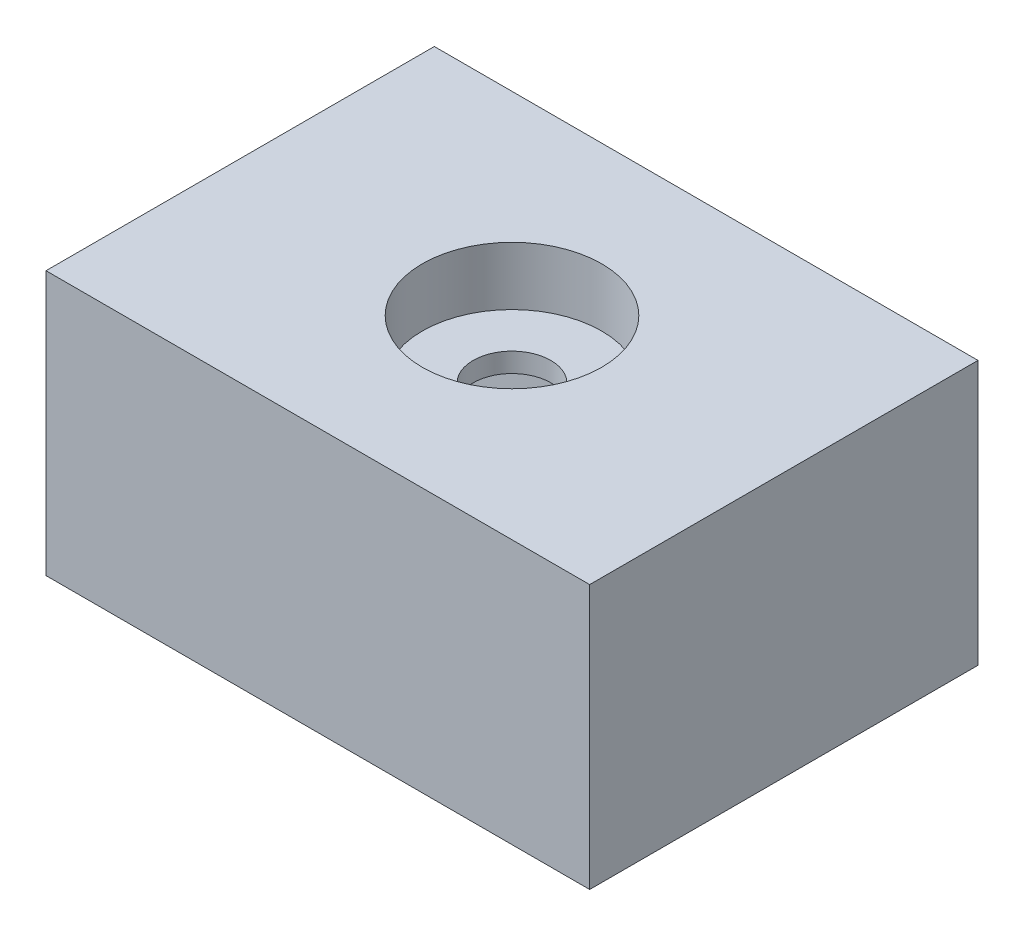
ISO-10303-21;
HEADER;
FILE_DESCRIPTION(('STEP AP214'),'2;1');
FILE_NAME('part.step','',(''),(''),'','','');
FILE_SCHEMA(('AUTOMOTIVE_DESIGN { 1 0 10303 214 1 1 1 1 }'));
ENDSEC;
DATA;
#1=APPLICATION_CONTEXT('core data for automotive mechanical design processes');
#2=APPLICATION_PROTOCOL_DEFINITION('international standard','automotive_design',2000,#1);
#3=PRODUCT_CONTEXT('',#1,'mechanical');
#4=PRODUCT('Part','Part','',(#3));
#5=PRODUCT_RELATED_PRODUCT_CATEGORY('part','',(#4));
#6=PRODUCT_DEFINITION_FORMATION('','',#4);
#7=PRODUCT_DEFINITION_CONTEXT('part definition',#1,'design');
#8=PRODUCT_DEFINITION('design','',#6,#7);
#9=PRODUCT_DEFINITION_SHAPE('','',#8);
#10=(LENGTH_UNIT() NAMED_UNIT(*) SI_UNIT(.MILLI.,.METRE.));
#11=(NAMED_UNIT(*) PLANE_ANGLE_UNIT() SI_UNIT($,.RADIAN.));
#12=(NAMED_UNIT(*) SI_UNIT($,.STERADIAN.) SOLID_ANGLE_UNIT());
#13=UNCERTAINTY_MEASURE_WITH_UNIT(LENGTH_MEASURE(1.E-05),#10,'distance_accuracy_value','');
#14=(GEOMETRIC_REPRESENTATION_CONTEXT(3) GLOBAL_UNCERTAINTY_ASSIGNED_CONTEXT((#13)) GLOBAL_UNIT_ASSIGNED_CONTEXT((#10,
#11,#12)) REPRESENTATION_CONTEXT('',''));
#15=CARTESIAN_POINT('',(0.,0.,0.));
#16=DIRECTION('',(0.,0.,1.));
#17=DIRECTION('',(1.,0.,0.));
#18=AXIS2_PLACEMENT_3D('',#15,#16,#17);
#19=CARTESIAN_POINT('',(88.9,86.36,-63.5));
#20=DIRECTION('',(-1.,0.,0.));
#21=DIRECTION('',(0.,0.,1.));
#22=AXIS2_PLACEMENT_3D('',#19,#20,#21);
#23=PLANE('',#22);
#24=DIRECTION('',(0.,0.,-1.));
#25=VECTOR('',#24,1.);
#26=CARTESIAN_POINT('',(88.9,0.,-63.5));
#27=LINE('',#26,#25);
#28=CARTESIAN_POINT('',(88.9,0.,63.5));
#29=VERTEX_POINT('',#28);
#30=CARTESIAN_POINT('',(88.9,0.,-63.5));
#31=VERTEX_POINT('',#30);
#32=EDGE_CURVE('E165',#29,#31,#27,.T.);
#33=ORIENTED_EDGE('',*,*,#32,.T.);
#34=DIRECTION('',(0.,-1.,0.));
#35=VECTOR('',#34,1.);
#36=CARTESIAN_POINT('',(88.9,86.36,-63.5));
#37=LINE('',#36,#35);
#38=CARTESIAN_POINT('',(88.9,86.36,-63.5));
#39=VERTEX_POINT('',#38);
#40=EDGE_CURVE('E11',#39,#31,#37,.T.);
#41=ORIENTED_EDGE('',*,*,#40,.F.);
#42=DIRECTION('',(0.,0.,-1.));
#43=VECTOR('',#42,1.);
#44=CARTESIAN_POINT('',(88.9,86.36,-63.5));
#45=LINE('',#44,#43);
#46=CARTESIAN_POINT('',(88.9,86.36,63.5));
#47=VERTEX_POINT('',#46);
#48=EDGE_CURVE('E167',#47,#39,#45,.T.);
#49=ORIENTED_EDGE('',*,*,#48,.F.);
#50=DIRECTION('',(0.,-1.,0.));
#51=VECTOR('',#50,1.);
#52=CARTESIAN_POINT('',(88.9,86.36,63.5));
#53=LINE('',#52,#51);
#54=EDGE_CURVE('E173',#47,#29,#53,.T.);
#55=ORIENTED_EDGE('',*,*,#54,.T.);
#56=EDGE_LOOP('',(#33,#41,#49,#55));
#57=FACE_BOUND('',#56,.T.);
#58=ADVANCED_FACE('F39',(#57),#23,.F.);
#59=CARTESIAN_POINT('',(-88.9,86.36,-63.5));
#60=DIRECTION('',(0.,0.,1.));
#61=DIRECTION('',(1.,0.,0.));
#62=AXIS2_PLACEMENT_3D('',#59,#60,#61);
#63=PLANE('',#62);
#64=DIRECTION('',(-1.,0.,0.));
#65=VECTOR('',#64,1.);
#66=CARTESIAN_POINT('',(-88.9,0.,-63.5));
#67=LINE('',#66,#65);
#68=CARTESIAN_POINT('',(-88.9,0.,-63.5));
#69=VERTEX_POINT('',#68);
#70=EDGE_CURVE('E176',#31,#69,#67,.T.);
#71=ORIENTED_EDGE('',*,*,#70,.T.);
#72=DIRECTION('',(0.,-1.,0.));
#73=VECTOR('',#72,1.);
#74=CARTESIAN_POINT('',(-88.9,86.36,-63.5));
#75=LINE('',#74,#73);
#76=CARTESIAN_POINT('',(-88.9,86.36,-63.5));
#77=VERTEX_POINT('',#76);
#78=EDGE_CURVE('E46',#77,#69,#75,.T.);
#79=ORIENTED_EDGE('',*,*,#78,.F.);
#80=DIRECTION('',(-1.,0.,0.));
#81=VECTOR('',#80,1.);
#82=CARTESIAN_POINT('',(-88.9,86.36,-63.5));
#83=LINE('',#82,#81);
#84=EDGE_CURVE('E90',#39,#77,#83,.T.);
#85=ORIENTED_EDGE('',*,*,#84,.F.);
#86=ORIENTED_EDGE('',*,*,#40,.T.);
#87=EDGE_LOOP('',(#71,#79,#85,#86));
#88=FACE_BOUND('',#87,.T.);
#89=ADVANCED_FACE('F205',(#88),#63,.F.);
#90=CARTESIAN_POINT('',(-88.9,86.36,-63.5));
#91=DIRECTION('',(1.,0.,0.));
#92=DIRECTION('',(0.,0.,-1.));
#93=AXIS2_PLACEMENT_3D('',#90,#91,#92);
#94=PLANE('',#93);
#95=DIRECTION('',(0.,0.,1.));
#96=VECTOR('',#95,1.);
#97=CARTESIAN_POINT('',(-88.9,0.,-63.5));
#98=LINE('',#97,#96);
#99=CARTESIAN_POINT('',(-88.9,0.,63.5));
#100=VERTEX_POINT('',#99);
#101=EDGE_CURVE('E178',#69,#100,#98,.T.);
#102=ORIENTED_EDGE('',*,*,#101,.T.);
#103=DIRECTION('',(0.,-1.,0.));
#104=VECTOR('',#103,1.);
#105=CARTESIAN_POINT('',(-88.9,86.36,63.5));
#106=LINE('',#105,#104);
#107=CARTESIAN_POINT('',(-88.9,86.36,63.5));
#108=VERTEX_POINT('',#107);
#109=EDGE_CURVE('E182',#108,#100,#106,.T.);
#110=ORIENTED_EDGE('',*,*,#109,.F.);
#111=DIRECTION('',(0.,0.,1.));
#112=VECTOR('',#111,1.);
#113=CARTESIAN_POINT('',(-88.9,86.36,-63.5));
#114=LINE('',#113,#112);
#115=EDGE_CURVE('E170',#77,#108,#114,.T.);
#116=ORIENTED_EDGE('',*,*,#115,.F.);
#117=ORIENTED_EDGE('',*,*,#78,.T.);
#118=EDGE_LOOP('',(#102,#110,#116,#117));
#119=FACE_BOUND('',#118,.T.);
#120=ADVANCED_FACE('F187',(#119),#94,.F.);
#121=CARTESIAN_POINT('',(-88.9,86.36,63.5));
#122=DIRECTION('',(0.,0.,-1.));
#123=DIRECTION('',(-1.,0.,0.));
#124=AXIS2_PLACEMENT_3D('',#121,#122,#123);
#125=PLANE('',#124);
#126=DIRECTION('',(1.,0.,0.));
#127=VECTOR('',#126,1.);
#128=CARTESIAN_POINT('',(-88.9,0.,63.5));
#129=LINE('',#128,#127);
#130=EDGE_CURVE('E83',#100,#29,#129,.T.);
#131=ORIENTED_EDGE('',*,*,#130,.T.);
#132=ORIENTED_EDGE('',*,*,#54,.F.);
#133=DIRECTION('',(1.,0.,0.));
#134=VECTOR('',#133,1.);
#135=CARTESIAN_POINT('',(-88.9,86.36,63.5));
#136=LINE('',#135,#134);
#137=EDGE_CURVE('E62',#108,#47,#136,.T.);
#138=ORIENTED_EDGE('',*,*,#137,.F.);
#139=ORIENTED_EDGE('',*,*,#109,.T.);
#140=EDGE_LOOP('',(#131,#132,#138,#139));
#141=FACE_BOUND('',#140,.T.);
#142=ADVANCED_FACE('F195',(#141),#125,.F.);
#143=CARTESIAN_POINT('',(0.,86.36,0.));
#144=DIRECTION('',(0.,1.,0.));
#145=DIRECTION('',(0.,0.,1.));
#146=AXIS2_PLACEMENT_3D('',#143,#144,#145);
#147=PLANE('',#146);
#148=CARTESIAN_POINT('',(0.,86.36,0.));
#149=DIRECTION('',(0.,1.,0.));
#150=DIRECTION('',(0.,0.,1.));
#151=AXIS2_PLACEMENT_3D('',#148,#149,#150);
#152=CIRCLE('',#151,29.337);
#153=CARTESIAN_POINT('',(0.,86.36,29.337));
#154=VERTEX_POINT('',#153);
#155=EDGE_CURVE('E135',#154,#154,#152,.T.);
#156=ORIENTED_EDGE('',*,*,#155,.F.);
#157=EDGE_LOOP('',(#156));
#158=FACE_BOUND('',#157,.T.);
#159=ORIENTED_EDGE('',*,*,#48,.T.);
#160=ORIENTED_EDGE('',*,*,#84,.T.);
#161=ORIENTED_EDGE('',*,*,#115,.T.);
#162=ORIENTED_EDGE('',*,*,#137,.T.);
#163=EDGE_LOOP('',(#159,#160,#161,#162));
#164=FACE_BOUND('',#163,.T.);
#165=ADVANCED_FACE('F197',(#158,#164),#147,.T.);
#166=CARTESIAN_POINT('',(0.,0.,0.));
#167=DIRECTION('',(0.,1.,0.));
#168=DIRECTION('',(0.,0.,1.));
#169=AXIS2_PLACEMENT_3D('',#166,#167,#168);
#170=PLANE('',#169);
#171=DIRECTION('',(1.,0.,0.));
#172=VECTOR('',#171,1.);
#173=CARTESIAN_POINT('',(-88.9,0.,57.15));
#174=LINE('',#173,#172);
#175=CARTESIAN_POINT('',(-82.55,0.,57.15));
#176=VERTEX_POINT('',#175);
#177=CARTESIAN_POINT('',(82.55,0.,57.15));
#178=VERTEX_POINT('',#177);
#179=EDGE_CURVE('E130',#176,#178,#174,.T.);
#180=ORIENTED_EDGE('',*,*,#179,.T.);
#181=DIRECTION('',(0.,0.,-1.));
#182=VECTOR('',#181,1.);
#183=CARTESIAN_POINT('',(82.55,0.,-63.5));
#184=LINE('',#183,#182);
#185=CARTESIAN_POINT('',(82.55,0.,-57.15));
#186=VERTEX_POINT('',#185);
#187=EDGE_CURVE('E158',#178,#186,#184,.T.);
#188=ORIENTED_EDGE('',*,*,#187,.T.);
#189=DIRECTION('',(-1.,0.,0.));
#190=VECTOR('',#189,1.);
#191=CARTESIAN_POINT('',(-88.9,0.,-57.15));
#192=LINE('',#191,#190);
#193=CARTESIAN_POINT('',(-82.55,0.,-57.15));
#194=VERTEX_POINT('',#193);
#195=EDGE_CURVE('E134',#186,#194,#192,.T.);
#196=ORIENTED_EDGE('',*,*,#195,.T.);
#197=DIRECTION('',(0.,0.,1.));
#198=VECTOR('',#197,1.);
#199=CARTESIAN_POINT('',(-82.55,0.,-63.5));
#200=LINE('',#199,#198);
#201=EDGE_CURVE('E53',#194,#176,#200,.T.);
#202=ORIENTED_EDGE('',*,*,#201,.T.);
#203=EDGE_LOOP('',(#180,#188,#196,#202));
#204=FACE_BOUND('',#203,.T.);
#205=ORIENTED_EDGE('',*,*,#32,.F.);
#206=ORIENTED_EDGE('',*,*,#130,.F.);
#207=ORIENTED_EDGE('',*,*,#101,.F.);
#208=ORIENTED_EDGE('',*,*,#70,.F.);
#209=EDGE_LOOP('',(#205,#206,#207,#208));
#210=FACE_BOUND('',#209,.T.);
#211=ADVANCED_FACE('F191',(#204,#210),#170,.F.);
#212=CARTESIAN_POINT('',(0.,67.31,0.));
#213=DIRECTION('',(0.,1.,0.));
#214=DIRECTION('',(0.,0.,1.));
#215=AXIS2_PLACEMENT_3D('',#212,#213,#214);
#216=CYLINDRICAL_SURFACE('',#215,29.337);
#217=CARTESIAN_POINT('',(0.,67.31,0.));
#218=DIRECTION('',(0.,1.,0.));
#219=DIRECTION('',(0.,0.,1.));
#220=AXIS2_PLACEMENT_3D('',#217,#218,#219);
#221=CIRCLE('',#220,29.337);
#222=CARTESIAN_POINT('',(0.,67.31,29.337));
#223=VERTEX_POINT('',#222);
#224=EDGE_CURVE('E139',#223,#223,#221,.T.);
#225=CARTESIAN_POINT('',(0.,67.31,29.337));
#226=CARTESIAN_POINT('',(0.,67.5084375,29.337));
#227=CARTESIAN_POINT('',(0.,67.706875,29.337));
#228=CARTESIAN_POINT('',(0.,68.10375,29.337));
#229=CARTESIAN_POINT('',(0.,68.3021875,29.337));
#230=CARTESIAN_POINT('',(0.,68.6990625,29.337));
#231=CARTESIAN_POINT('',(0.,68.8975,29.337));
#232=CARTESIAN_POINT('',(0.,69.294375,29.337));
#233=CARTESIAN_POINT('',(0.,69.4928125,29.337));
#234=CARTESIAN_POINT('',(0.,69.8896875,29.337));
#235=CARTESIAN_POINT('',(0.,70.088125,29.337));
#236=CARTESIAN_POINT('',(0.,70.485,29.337));
#237=CARTESIAN_POINT('',(0.,70.6834375,29.337));
#238=CARTESIAN_POINT('',(0.,71.0803125,29.337));
#239=CARTESIAN_POINT('',(0.,71.27875,29.337));
#240=CARTESIAN_POINT('',(0.,71.675625,29.337));
#241=CARTESIAN_POINT('',(0.,71.8740625,29.337));
#242=CARTESIAN_POINT('',(0.,72.2709375,29.337));
#243=CARTESIAN_POINT('',(0.,72.469375,29.337));
#244=CARTESIAN_POINT('',(0.,72.86625,29.337));
#245=CARTESIAN_POINT('',(0.,73.0646875,29.337));
#246=CARTESIAN_POINT('',(0.,73.4615625,29.337));
#247=CARTESIAN_POINT('',(0.,73.66,29.337));
#248=CARTESIAN_POINT('',(0.,74.056875,29.337));
#249=CARTESIAN_POINT('',(0.,74.2553125,29.337));
#250=CARTESIAN_POINT('',(0.,74.6521875,29.337));
#251=CARTESIAN_POINT('',(0.,74.850625,29.337));
#252=CARTESIAN_POINT('',(0.,75.2475,29.337));
#253=CARTESIAN_POINT('',(0.,75.4459375,29.337));
#254=CARTESIAN_POINT('',(0.,75.8428125,29.337));
#255=CARTESIAN_POINT('',(0.,76.04125,29.337));
#256=CARTESIAN_POINT('',(0.,76.438125,29.337));
#257=CARTESIAN_POINT('',(0.,76.6365625,29.337));
#258=CARTESIAN_POINT('',(0.,77.0334375,29.337));
#259=CARTESIAN_POINT('',(0.,77.231875,29.337));
#260=CARTESIAN_POINT('',(0.,77.62875,29.337));
#261=CARTESIAN_POINT('',(0.,77.8271875,29.337));
#262=CARTESIAN_POINT('',(0.,78.2240625,29.337));
#263=CARTESIAN_POINT('',(0.,78.4225,29.337));
#264=CARTESIAN_POINT('',(0.,78.819375,29.337));
#265=CARTESIAN_POINT('',(0.,79.0178125,29.337));
#266=CARTESIAN_POINT('',(0.,79.4146875,29.337));
#267=CARTESIAN_POINT('',(0.,79.613125,29.337));
#268=CARTESIAN_POINT('',(0.,80.01,29.337));
#269=CARTESIAN_POINT('',(0.,80.2084375,29.337));
#270=CARTESIAN_POINT('',(0.,80.6053125,29.337));
#271=CARTESIAN_POINT('',(0.,80.80375,29.337));
#272=CARTESIAN_POINT('',(0.,81.200625,29.337));
#273=CARTESIAN_POINT('',(0.,81.3990625,29.337));
#274=CARTESIAN_POINT('',(0.,81.7959375,29.337));
#275=CARTESIAN_POINT('',(0.,81.994375,29.337));
#276=CARTESIAN_POINT('',(0.,82.39125,29.337));
#277=CARTESIAN_POINT('',(0.,82.5896875,29.337));
#278=CARTESIAN_POINT('',(0.,82.9865625,29.337));
#279=CARTESIAN_POINT('',(0.,83.185,29.337));
#280=CARTESIAN_POINT('',(0.,83.581875,29.337));
#281=CARTESIAN_POINT('',(0.,83.7803125,29.337));
#282=CARTESIAN_POINT('',(0.,84.1771875,29.337));
#283=CARTESIAN_POINT('',(0.,84.375625,29.337));
#284=CARTESIAN_POINT('',(0.,84.7725,29.337));
#285=CARTESIAN_POINT('',(0.,84.9709375,29.337));
#286=CARTESIAN_POINT('',(0.,85.3678125,29.337));
#287=CARTESIAN_POINT('',(0.,85.56625,29.337));
#288=CARTESIAN_POINT('',(0.,85.963125,29.337));
#289=CARTESIAN_POINT('',(0.,86.1615625,29.337));
#290=CARTESIAN_POINT('',(0.,86.36,29.337));
#291=B_SPLINE_CURVE_WITH_KNOTS('',3,(#225,#226,#227,#228,#229,#230,#231,#232,#233,#234,#235,
#236,#237,#238,#239,#240,#241,#242,#243,#244,#245,#246,#247,#248,#249,#250,#251,#252,#253,#254,
#255,#256,#257,#258,#259,#260,#261,#262,#263,#264,#265,#266,#267,#268,#269,#270,#271,#272,#273,
#274,#275,#276,#277,#278,#279,#280,#281,#282,#283,#284,#285,#286,#287,#288,#289,#290),
.UNSPECIFIED.,.F.,.F.,(4,2,2,2,2,2,2,2,2,2,2,2,2,2,2,2,2,2,2,2,2,2,2,2,2,2,2,2,2,2,2,2,4),(0.,
0.5953125,1.190625,1.7859375,2.38125,2.9765625,3.571875,4.1671875,4.7625,5.3578125,5.953125,
6.5484375,7.14375,7.7390625,8.334375,8.92968750000001,9.52500000000001,10.1203125,10.715625,
11.3109375,11.90625,12.5015625,13.096875,13.6921875,14.2875,14.8828125,15.478125,16.0734375,
16.66875,17.2640625,17.859375,18.4546875,19.05),.UNSPECIFIED.);
#292=EDGE_CURVE('BSEAM240',#223,#154,#291,.T.);
#293=ORIENTED_EDGE('',*,*,#224,.F.);
#294=ORIENTED_EDGE('',*,*,#155,.T.);
#295=ORIENTED_EDGE('',*,*,#292,.T.);
#296=ORIENTED_EDGE('',*,*,#292,.F.);
#297=EDGE_LOOP('',(#293,#295,#294,#296));
#298=FACE_BOUND('',#297,.T.);
#299=ADVANCED_FACE('F240',(#298),#216,.F.);
#300=CARTESIAN_POINT('',(0.,67.31,0.));
#301=DIRECTION('',(0.,1.,0.));
#302=DIRECTION('',(0.,0.,1.));
#303=AXIS2_PLACEMENT_3D('',#300,#301,#302);
#304=PLANE('',#303);
#305=CARTESIAN_POINT('',(0.,67.31,0.));
#306=DIRECTION('',(0.,1.,0.));
#307=DIRECTION('',(0.,0.,1.));
#308=AXIS2_PLACEMENT_3D('',#305,#306,#307);
#309=CIRCLE('',#308,12.7);
#310=CARTESIAN_POINT('',(0.,67.31,-12.7));
#311=VERTEX_POINT('',#310);
#312=EDGE_CURVE('E144',#311,#311,#309,.F.);
#313=ORIENTED_EDGE('',*,*,#312,.T.);
#314=EDGE_LOOP('',(#313));
#315=FACE_BOUND('',#314,.T.);
#316=ORIENTED_EDGE('',*,*,#224,.T.);
#317=EDGE_LOOP('',(#316));
#318=FACE_BOUND('',#317,.T.);
#319=ADVANCED_FACE('F249',(#315,#318),#304,.T.);
#320=CARTESIAN_POINT('',(82.55,86.36,-63.5));
#321=DIRECTION('',(-1.,0.,0.));
#322=DIRECTION('',(0.,0.,1.));
#323=AXIS2_PLACEMENT_3D('',#320,#321,#322);
#324=PLANE('',#323);
#325=ORIENTED_EDGE('',*,*,#187,.F.);
#326=DIRECTION('',(0.,-1.,0.));
#327=VECTOR('',#326,1.);
#328=CARTESIAN_POINT('',(82.55,86.36,57.15));
#329=LINE('',#328,#327);
#330=CARTESIAN_POINT('',(82.55,80.01,57.15));
#331=VERTEX_POINT('',#330);
#332=EDGE_CURVE('E129',#331,#178,#329,.T.);
#333=ORIENTED_EDGE('',*,*,#332,.F.);
#334=DIRECTION('',(0.,0.,-1.));
#335=VECTOR('',#334,1.);
#336=CARTESIAN_POINT('',(82.55,80.01,-63.5));
#337=LINE('',#336,#335);
#338=CARTESIAN_POINT('',(82.55,80.01,-57.15));
#339=VERTEX_POINT('',#338);
#340=EDGE_CURVE('E117',#331,#339,#337,.T.);
#341=ORIENTED_EDGE('',*,*,#340,.T.);
#342=DIRECTION('',(0.,-1.,0.));
#343=VECTOR('',#342,1.);
#344=CARTESIAN_POINT('',(82.55,86.36,-57.15));
#345=LINE('',#344,#343);
#346=EDGE_CURVE('E127',#339,#186,#345,.T.);
#347=ORIENTED_EDGE('',*,*,#346,.T.);
#348=EDGE_LOOP('',(#325,#333,#341,#347));
#349=FACE_BOUND('',#348,.T.);
#350=ADVANCED_FACE('F126',(#349),#324,.T.);
#351=CARTESIAN_POINT('',(-88.9,86.36,-57.15));
#352=DIRECTION('',(0.,0.,1.));
#353=DIRECTION('',(1.,0.,0.));
#354=AXIS2_PLACEMENT_3D('',#351,#352,#353);
#355=PLANE('',#354);
#356=ORIENTED_EDGE('',*,*,#195,.F.);
#357=ORIENTED_EDGE('',*,*,#346,.F.);
#358=DIRECTION('',(-1.,0.,0.));
#359=VECTOR('',#358,1.);
#360=CARTESIAN_POINT('',(-88.9,80.01,-57.15));
#361=LINE('',#360,#359);
#362=CARTESIAN_POINT('',(-82.55,80.01,-57.15));
#363=VERTEX_POINT('',#362);
#364=EDGE_CURVE('E113',#339,#363,#361,.T.);
#365=ORIENTED_EDGE('',*,*,#364,.T.);
#366=DIRECTION('',(0.,-1.,0.));
#367=VECTOR('',#366,1.);
#368=CARTESIAN_POINT('',(-82.55,86.36,-57.15));
#369=LINE('',#368,#367);
#370=EDGE_CURVE('E136',#363,#194,#369,.T.);
#371=ORIENTED_EDGE('',*,*,#370,.T.);
#372=EDGE_LOOP('',(#356,#357,#365,#371));
#373=FACE_BOUND('',#372,.T.);
#374=ADVANCED_FACE('F132',(#373),#355,.T.);
#375=CARTESIAN_POINT('',(-82.55,86.36,-63.5));
#376=DIRECTION('',(1.,0.,0.));
#377=DIRECTION('',(0.,0.,-1.));
#378=AXIS2_PLACEMENT_3D('',#375,#376,#377);
#379=PLANE('',#378);
#380=ORIENTED_EDGE('',*,*,#201,.F.);
#381=ORIENTED_EDGE('',*,*,#370,.F.);
#382=DIRECTION('',(0.,0.,1.));
#383=VECTOR('',#382,1.);
#384=CARTESIAN_POINT('',(-82.55,80.01,-63.5));
#385=LINE('',#384,#383);
#386=CARTESIAN_POINT('',(-82.55,80.01,57.15));
#387=VERTEX_POINT('',#386);
#388=EDGE_CURVE('E118',#363,#387,#385,.T.);
#389=ORIENTED_EDGE('',*,*,#388,.T.);
#390=DIRECTION('',(0.,-1.,0.));
#391=VECTOR('',#390,1.);
#392=CARTESIAN_POINT('',(-82.55,86.36,57.15));
#393=LINE('',#392,#391);
#394=EDGE_CURVE('E141',#387,#176,#393,.T.);
#395=ORIENTED_EDGE('',*,*,#394,.T.);
#396=EDGE_LOOP('',(#380,#381,#389,#395));
#397=FACE_BOUND('',#396,.T.);
#398=ADVANCED_FACE('F277',(#397),#379,.T.);
#399=CARTESIAN_POINT('',(-88.9,86.36,57.15));
#400=DIRECTION('',(0.,0.,-1.));
#401=DIRECTION('',(-1.,0.,0.));
#402=AXIS2_PLACEMENT_3D('',#399,#400,#401);
#403=PLANE('',#402);
#404=ORIENTED_EDGE('',*,*,#179,.F.);
#405=ORIENTED_EDGE('',*,*,#394,.F.);
#406=DIRECTION('',(1.,0.,0.));
#407=VECTOR('',#406,1.);
#408=CARTESIAN_POINT('',(-88.9,80.01,57.15));
#409=LINE('',#408,#407);
#410=EDGE_CURVE('E147',#387,#331,#409,.T.);
#411=ORIENTED_EDGE('',*,*,#410,.T.);
#412=ORIENTED_EDGE('',*,*,#332,.T.);
#413=EDGE_LOOP('',(#404,#405,#411,#412));
#414=FACE_BOUND('',#413,.T.);
#415=ADVANCED_FACE('F286',(#414),#403,.T.);
#416=CARTESIAN_POINT('',(0.,80.01,0.));
#417=DIRECTION('',(0.,1.,0.));
#418=DIRECTION('',(0.,0.,1.));
#419=AXIS2_PLACEMENT_3D('',#416,#417,#418);
#420=PLANE('',#419);
#421=CARTESIAN_POINT('',(0.,80.01,0.));
#422=DIRECTION('',(0.,1.,0.));
#423=DIRECTION('',(0.,0.,1.));
#424=AXIS2_PLACEMENT_3D('',#421,#422,#423);
#425=CIRCLE('',#424,35.687);
#426=CARTESIAN_POINT('',(0.,80.01,35.687));
#427=VERTEX_POINT('',#426);
#428=EDGE_CURVE('E152',#427,#427,#425,.T.);
#429=ORIENTED_EDGE('',*,*,#428,.T.);
#430=EDGE_LOOP('',(#429));
#431=FACE_BOUND('',#430,.T.);
#432=ORIENTED_EDGE('',*,*,#340,.F.);
#433=ORIENTED_EDGE('',*,*,#410,.F.);
#434=ORIENTED_EDGE('',*,*,#388,.F.);
#435=ORIENTED_EDGE('',*,*,#364,.F.);
#436=EDGE_LOOP('',(#432,#433,#434,#435));
#437=FACE_BOUND('',#436,.T.);
#438=ADVANCED_FACE('F115',(#431,#437),#420,.F.);
#439=CARTESIAN_POINT('',(0.,67.31,0.));
#440=DIRECTION('',(0.,1.,0.));
#441=DIRECTION('',(0.,0.,1.));
#442=AXIS2_PLACEMENT_3D('',#439,#440,#441);
#443=CYLINDRICAL_SURFACE('',#442,35.687);
#444=CARTESIAN_POINT('',(0.,60.96,0.));
#445=DIRECTION('',(0.,1.,0.));
#446=DIRECTION('',(0.,0.,1.));
#447=AXIS2_PLACEMENT_3D('',#444,#445,#446);
#448=CIRCLE('',#447,35.687);
#449=CARTESIAN_POINT('',(0.,60.96,35.687));
#450=VERTEX_POINT('',#449);
#451=EDGE_CURVE('E155',#450,#450,#448,.T.);
#452=CARTESIAN_POINT('',(0.,60.96,35.687));
#453=CARTESIAN_POINT('',(0.,61.1584375,35.687));
#454=CARTESIAN_POINT('',(0.,61.356875,35.687));
#455=CARTESIAN_POINT('',(0.,61.75375,35.687));
#456=CARTESIAN_POINT('',(0.,61.9521875,35.687));
#457=CARTESIAN_POINT('',(0.,62.3490625,35.687));
#458=CARTESIAN_POINT('',(0.,62.5475,35.687));
#459=CARTESIAN_POINT('',(0.,62.944375,35.687));
#460=CARTESIAN_POINT('',(0.,63.1428125,35.687));
#461=CARTESIAN_POINT('',(0.,63.5396875,35.687));
#462=CARTESIAN_POINT('',(0.,63.738125,35.687));
#463=CARTESIAN_POINT('',(0.,64.135,35.687));
#464=CARTESIAN_POINT('',(0.,64.3334375,35.687));
#465=CARTESIAN_POINT('',(0.,64.7303125,35.687));
#466=CARTESIAN_POINT('',(0.,64.92875,35.687));
#467=CARTESIAN_POINT('',(0.,65.325625,35.687));
#468=CARTESIAN_POINT('',(0.,65.5240625,35.687));
#469=CARTESIAN_POINT('',(0.,65.9209375,35.687));
#470=CARTESIAN_POINT('',(0.,66.119375,35.687));
#471=CARTESIAN_POINT('',(0.,66.51625,35.687));
#472=CARTESIAN_POINT('',(0.,66.7146875,35.687));
#473=CARTESIAN_POINT('',(0.,67.1115625,35.687));
#474=CARTESIAN_POINT('',(0.,67.31,35.687));
#475=CARTESIAN_POINT('',(0.,67.706875,35.687));
#476=CARTESIAN_POINT('',(0.,67.9053125,35.687));
#477=CARTESIAN_POINT('',(0.,68.3021875,35.687));
#478=CARTESIAN_POINT('',(0.,68.500625,35.687));
#479=CARTESIAN_POINT('',(0.,68.8975,35.687));
#480=CARTESIAN_POINT('',(0.,69.0959375,35.687));
#481=CARTESIAN_POINT('',(0.,69.4928125,35.687));
#482=CARTESIAN_POINT('',(0.,69.69125,35.687));
#483=CARTESIAN_POINT('',(0.,70.088125,35.687));
#484=CARTESIAN_POINT('',(0.,70.2865625,35.687));
#485=CARTESIAN_POINT('',(0.,70.6834375,35.687));
#486=CARTESIAN_POINT('',(0.,70.881875,35.687));
#487=CARTESIAN_POINT('',(0.,71.27875,35.687));
#488=CARTESIAN_POINT('',(0.,71.4771875,35.687));
#489=CARTESIAN_POINT('',(0.,71.8740625,35.687));
#490=CARTESIAN_POINT('',(0.,72.0725,35.687));
#491=CARTESIAN_POINT('',(0.,72.469375,35.687));
#492=CARTESIAN_POINT('',(0.,72.6678125,35.687));
#493=CARTESIAN_POINT('',(0.,73.0646875,35.687));
#494=CARTESIAN_POINT('',(0.,73.263125,35.687));
#495=CARTESIAN_POINT('',(0.,73.66,35.687));
#496=CARTESIAN_POINT('',(0.,73.8584375,35.687));
#497=CARTESIAN_POINT('',(0.,74.2553125,35.687));
#498=CARTESIAN_POINT('',(0.,74.45375,35.687));
#499=CARTESIAN_POINT('',(0.,74.850625,35.687));
#500=CARTESIAN_POINT('',(0.,75.0490625,35.687));
#501=CARTESIAN_POINT('',(0.,75.4459375,35.687));
#502=CARTESIAN_POINT('',(0.,75.644375,35.687));
#503=CARTESIAN_POINT('',(0.,76.04125,35.687));
#504=CARTESIAN_POINT('',(0.,76.2396875,35.687));
#505=CARTESIAN_POINT('',(0.,76.6365625,35.687));
#506=CARTESIAN_POINT('',(0.,76.835,35.687));
#507=CARTESIAN_POINT('',(0.,77.231875,35.687));
#508=CARTESIAN_POINT('',(0.,77.4303125,35.687));
#509=CARTESIAN_POINT('',(0.,77.8271875,35.687));
#510=CARTESIAN_POINT('',(0.,78.025625,35.687));
#511=CARTESIAN_POINT('',(0.,78.4225,35.687));
#512=CARTESIAN_POINT('',(0.,78.6209375,35.687));
#513=CARTESIAN_POINT('',(0.,79.0178125,35.687));
#514=CARTESIAN_POINT('',(0.,79.21625,35.687));
#515=CARTESIAN_POINT('',(0.,79.613125,35.687));
#516=CARTESIAN_POINT('',(0.,79.8115625,35.687));
#517=CARTESIAN_POINT('',(0.,80.01,35.687));
#518=B_SPLINE_CURVE_WITH_KNOTS('',3,(#452,#453,#454,#455,#456,#457,#458,#459,#460,#461,#462,
#463,#464,#465,#466,#467,#468,#469,#470,#471,#472,#473,#474,#475,#476,#477,#478,#479,#480,#481,
#482,#483,#484,#485,#486,#487,#488,#489,#490,#491,#492,#493,#494,#495,#496,#497,#498,#499,#500,
#501,#502,#503,#504,#505,#506,#507,#508,#509,#510,#511,#512,#513,#514,#515,#516,#517),
.UNSPECIFIED.,.F.,.F.,(4,2,2,2,2,2,2,2,2,2,2,2,2,2,2,2,2,2,2,2,2,2,2,2,2,2,2,2,2,2,2,2,4),(0.,
0.5953125,1.19062499999999,1.78593749999999,2.38124999999999,2.97656249999999,3.571875,
4.1671875,4.7625,5.3578125,5.953125,6.5484375,7.14375,7.7390625,8.334375,8.9296875,9.525,
10.1203125,10.715625,11.3109375,11.90625,12.5015625,13.096875,13.6921875,14.2875,14.8828125,
15.478125,16.0734375,16.66875,17.2640625,17.859375,18.4546875,19.05),.UNSPECIFIED.);
#519=EDGE_CURVE('BSEAM304',#450,#427,#518,.T.);
#520=ORIENTED_EDGE('',*,*,#451,.T.);
#521=ORIENTED_EDGE('',*,*,#428,.F.);
#522=ORIENTED_EDGE('',*,*,#519,.T.);
#523=ORIENTED_EDGE('',*,*,#519,.F.);
#524=EDGE_LOOP('',(#520,#522,#521,#523));
#525=FACE_BOUND('',#524,.T.);
#526=ADVANCED_FACE('F304',(#525),#443,.T.);
#527=CARTESIAN_POINT('',(0.,60.96,0.));
#528=DIRECTION('',(0.,1.,0.));
#529=DIRECTION('',(0.,0.,1.));
#530=AXIS2_PLACEMENT_3D('',#527,#528,#529);
#531=PLANE('',#530);
#532=CARTESIAN_POINT('',(0.,60.96,0.));
#533=DIRECTION('',(0.,-1.,0.));
#534=DIRECTION('',(0.,0.,-1.));
#535=AXIS2_PLACEMENT_3D('',#532,#533,#534);
#536=CIRCLE('',#535,12.7);
#537=CARTESIAN_POINT('',(0.,60.96,-12.7));
#538=VERTEX_POINT('',#537);
#539=EDGE_CURVE('E338',#538,#538,#536,.T.);
#540=ORIENTED_EDGE('',*,*,#539,.F.);
#541=EDGE_LOOP('',(#540));
#542=FACE_BOUND('',#541,.T.);
#543=ORIENTED_EDGE('',*,*,#451,.F.);
#544=EDGE_LOOP('',(#543));
#545=FACE_BOUND('',#544,.T.);
#546=ADVANCED_FACE('F313',(#542,#545),#531,.F.);
#547=CARTESIAN_POINT('',(0.,103.231024484277,0.));
#548=DIRECTION('',(0.,-1.,0.));
#549=DIRECTION('',(0.,0.,-1.));
#550=AXIS2_PLACEMENT_3D('',#547,#548,#549);
#551=CYLINDRICAL_SURFACE('',#550,12.7);
#552=CARTESIAN_POINT('',(0.,60.96,-12.7));
#553=CARTESIAN_POINT('',(0.,61.0261458333333,-12.7));
#554=CARTESIAN_POINT('',(0.,61.0922916666667,-12.7));
#555=CARTESIAN_POINT('',(0.,61.2245833333333,-12.7));
#556=CARTESIAN_POINT('',(0.,61.2907291666667,-12.7));
#557=CARTESIAN_POINT('',(0.,61.4230208333333,-12.7));
#558=CARTESIAN_POINT('',(0.,61.4891666666667,-12.7));
#559=CARTESIAN_POINT('',(0.,61.6214583333333,-12.7));
#560=CARTESIAN_POINT('',(0.,61.6876041666667,-12.7));
#561=CARTESIAN_POINT('',(0.,61.8198958333333,-12.7));
#562=CARTESIAN_POINT('',(0.,61.8860416666667,-12.7));
#563=CARTESIAN_POINT('',(0.,62.0183333333333,-12.7));
#564=CARTESIAN_POINT('',(0.,62.0844791666667,-12.7));
#565=CARTESIAN_POINT('',(0.,62.2167708333333,-12.7));
#566=CARTESIAN_POINT('',(0.,62.2829166666667,-12.7));
#567=CARTESIAN_POINT('',(0.,62.4152083333333,-12.7));
#568=CARTESIAN_POINT('',(0.,62.4813541666667,-12.7));
#569=CARTESIAN_POINT('',(0.,62.6136458333333,-12.7));
#570=CARTESIAN_POINT('',(0.,62.6797916666667,-12.7));
#571=CARTESIAN_POINT('',(0.,62.8120833333333,-12.7));
#572=CARTESIAN_POINT('',(0.,62.8782291666667,-12.7));
#573=CARTESIAN_POINT('',(0.,63.0105208333333,-12.7));
#574=CARTESIAN_POINT('',(0.,63.0766666666667,-12.7));
#575=CARTESIAN_POINT('',(0.,63.2089583333333,-12.7));
#576=CARTESIAN_POINT('',(0.,63.2751041666667,-12.7));
#577=CARTESIAN_POINT('',(0.,63.4073958333333,-12.7));
#578=CARTESIAN_POINT('',(0.,63.4735416666667,-12.7));
#579=CARTESIAN_POINT('',(0.,63.6058333333333,-12.7));
#580=CARTESIAN_POINT('',(0.,63.6719791666667,-12.7));
#581=CARTESIAN_POINT('',(0.,63.8042708333333,-12.7));
#582=CARTESIAN_POINT('',(0.,63.8704166666666,-12.7));
#583=CARTESIAN_POINT('',(0.,64.0027083333333,-12.7));
#584=CARTESIAN_POINT('',(0.,64.0688541666667,-12.7));
#585=CARTESIAN_POINT('',(0.,64.2011458333333,-12.7));
#586=CARTESIAN_POINT('',(0.,64.2672916666667,-12.7));
#587=CARTESIAN_POINT('',(0.,64.3995833333333,-12.7));
#588=CARTESIAN_POINT('',(0.,64.4657291666666,-12.7));
#589=CARTESIAN_POINT('',(0.,64.5980208333333,-12.7));
#590=CARTESIAN_POINT('',(0.,64.6641666666667,-12.7));
#591=CARTESIAN_POINT('',(0.,64.7964583333333,-12.7));
#592=CARTESIAN_POINT('',(0.,64.8626041666667,-12.7));
#593=CARTESIAN_POINT('',(0.,64.9948958333333,-12.7));
#594=CARTESIAN_POINT('',(0.,65.0610416666667,-12.7));
#595=CARTESIAN_POINT('',(0.,65.1933333333333,-12.7));
#596=CARTESIAN_POINT('',(0.,65.2594791666667,-12.7));
#597=CARTESIAN_POINT('',(0.,65.3917708333333,-12.7));
#598=CARTESIAN_POINT('',(0.,65.4579166666667,-12.7));
#599=CARTESIAN_POINT('',(0.,65.5902083333333,-12.7));
#600=CARTESIAN_POINT('',(0.,65.6563541666667,-12.7));
#601=CARTESIAN_POINT('',(0.,65.7886458333333,-12.7));
#602=CARTESIAN_POINT('',(0.,65.8547916666667,-12.7));
#603=CARTESIAN_POINT('',(0.,65.9870833333333,-12.7));
#604=CARTESIAN_POINT('',(0.,66.0532291666667,-12.7));
#605=CARTESIAN_POINT('',(0.,66.1855208333333,-12.7));
#606=CARTESIAN_POINT('',(0.,66.2516666666667,-12.7));
#607=CARTESIAN_POINT('',(0.,66.3839583333333,-12.7));
#608=CARTESIAN_POINT('',(0.,66.4501041666667,-12.7));
#609=CARTESIAN_POINT('',(0.,66.5823958333333,-12.7));
#610=CARTESIAN_POINT('',(0.,66.6485416666667,-12.7));
#611=CARTESIAN_POINT('',(0.,66.7808333333333,-12.7));
#612=CARTESIAN_POINT('',(0.,66.8469791666667,-12.7));
#613=CARTESIAN_POINT('',(0.,66.9792708333333,-12.7));
#614=CARTESIAN_POINT('',(0.,67.0454166666667,-12.7));
#615=CARTESIAN_POINT('',(0.,67.1777083333333,-12.7));
#616=CARTESIAN_POINT('',(0.,67.2438541666667,-12.7));
#617=CARTESIAN_POINT('',(0.,67.31,-12.7));
#618=B_SPLINE_CURVE_WITH_KNOTS('',3,(#552,#553,#554,#555,#556,#557,#558,#559,#560,#561,#562,
#563,#564,#565,#566,#567,#568,#569,#570,#571,#572,#573,#574,#575,#576,#577,#578,#579,#580,#581,
#582,#583,#584,#585,#586,#587,#588,#589,#590,#591,#592,#593,#594,#595,#596,#597,#598,#599,#600,
#601,#602,#603,#604,#605,#606,#607,#608,#609,#610,#611,#612,#613,#614,#615,#616,#617),
.UNSPECIFIED.,.F.,.F.,(4,2,2,2,2,2,2,2,2,2,2,2,2,2,2,2,2,2,2,2,2,2,2,2,2,2,2,2,2,2,2,2,4),(0.,
0.198437500000002,0.396874999999998,0.5953125,0.793749999999996,0.992187499999998,1.190625,
1.3890625,1.5875,1.78593749999999,1.984375,2.1828125,2.38124999999999,2.5796875,2.778125,
2.97656249999999,3.175,3.3734375,3.571875,3.7703125,3.96874999999999,4.1671875,4.365625,
4.56406249999999,4.7625,4.96093750000001,5.15937499999999,5.3578125,5.55625000000001,
5.75468749999999,5.953125,6.15156249999999,6.34999999999999),.UNSPECIFIED.);
#619=EDGE_CURVE('BSEAM322',#538,#311,#618,.T.);
#620=ORIENTED_EDGE('',*,*,#539,.T.);
#621=ORIENTED_EDGE('',*,*,#312,.F.);
#622=ORIENTED_EDGE('',*,*,#619,.T.);
#623=ORIENTED_EDGE('',*,*,#619,.F.);
#624=EDGE_LOOP('',(#620,#622,#621,#623));
#625=FACE_BOUND('',#624,.T.);
#626=ADVANCED_FACE('F322',(#625),#551,.F.);
#627=CLOSED_SHELL('',(#58,#89,#120,#142,#165,#211,#299,#319,#350,#374,#398,#415,#438,#526,#546,#626));
#628=MANIFOLD_SOLID_BREP('B2',#627);
#629=ADVANCED_BREP_SHAPE_REPRESENTATION('',(#18,#628),#14);
#630=SHAPE_DEFINITION_REPRESENTATION(#9,#629);
ENDSEC;
END-ISO-10303-21;
